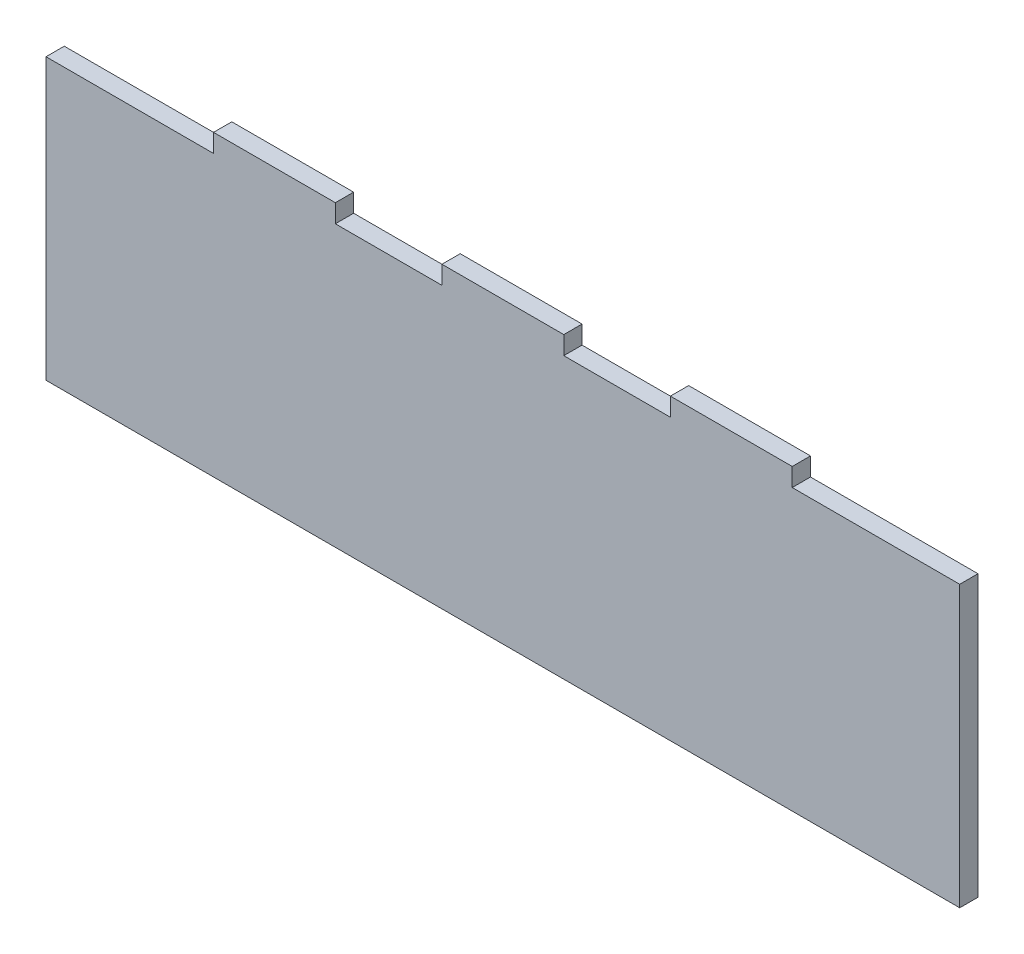
ISO-10303-21;
HEADER;
FILE_DESCRIPTION(('STEP AP214'),'2;1');
FILE_NAME('part.step','',(''),(''),'','','');
FILE_SCHEMA(('AUTOMOTIVE_DESIGN { 1 0 10303 214 1 1 1 1 }'));
ENDSEC;
DATA;
#1=APPLICATION_CONTEXT('core data for automotive mechanical design processes');
#2=APPLICATION_PROTOCOL_DEFINITION('international standard','automotive_design',2000,#1);
#3=PRODUCT_CONTEXT('',#1,'mechanical');
#4=PRODUCT('Part','Part','',(#3));
#5=PRODUCT_RELATED_PRODUCT_CATEGORY('part','',(#4));
#6=PRODUCT_DEFINITION_FORMATION('','',#4);
#7=PRODUCT_DEFINITION_CONTEXT('part definition',#1,'design');
#8=PRODUCT_DEFINITION('design','',#6,#7);
#9=PRODUCT_DEFINITION_SHAPE('','',#8);
#10=(LENGTH_UNIT() NAMED_UNIT(*) SI_UNIT(.MILLI.,.METRE.));
#11=(NAMED_UNIT(*) PLANE_ANGLE_UNIT() SI_UNIT($,.RADIAN.));
#12=(NAMED_UNIT(*) SI_UNIT($,.STERADIAN.) SOLID_ANGLE_UNIT());
#13=UNCERTAINTY_MEASURE_WITH_UNIT(LENGTH_MEASURE(1.E-05),#10,'distance_accuracy_value','');
#14=(GEOMETRIC_REPRESENTATION_CONTEXT(3) GLOBAL_UNCERTAINTY_ASSIGNED_CONTEXT((#13)) GLOBAL_UNIT_ASSIGNED_CONTEXT((#10,
#11,#12)) REPRESENTATION_CONTEXT('',''));
#15=CARTESIAN_POINT('',(0.,0.,0.));
#16=DIRECTION('',(0.,0.,1.));
#17=DIRECTION('',(1.,0.,0.));
#18=AXIS2_PLACEMENT_3D('',#15,#16,#17);
#19=CARTESIAN_POINT('',(27.5,0.,3.));
#20=DIRECTION('',(-1.,0.,0.));
#21=DIRECTION('',(0.,0.,1.));
#22=AXIS2_PLACEMENT_3D('',#19,#20,#21);
#23=PLANE('',#22);
#24=DIRECTION('',(0.,1.,0.));
#25=VECTOR('',#24,1.);
#26=CARTESIAN_POINT('',(27.5,0.,0.));
#27=LINE('',#26,#25);
#28=CARTESIAN_POINT('',(27.5,23.,0.));
#29=VERTEX_POINT('',#28);
#30=CARTESIAN_POINT('',(27.5,26.,0.));
#31=VERTEX_POINT('',#30);
#32=EDGE_CURVE('E179',#29,#31,#27,.T.);
#33=ORIENTED_EDGE('',*,*,#32,.F.);
#34=DIRECTION('',(0.,0.,-1.));
#35=VECTOR('',#34,1.);
#36=CARTESIAN_POINT('',(27.5,23.,3.));
#37=LINE('',#36,#35);
#38=CARTESIAN_POINT('',(27.5,23.,3.));
#39=VERTEX_POINT('',#38);
#40=EDGE_CURVE('E11',#39,#29,#37,.T.);
#41=ORIENTED_EDGE('',*,*,#40,.F.);
#42=DIRECTION('',(0.,1.,0.));
#43=VECTOR('',#42,1.);
#44=CARTESIAN_POINT('',(27.5,0.,3.));
#45=LINE('',#44,#43);
#46=CARTESIAN_POINT('',(27.5,26.,3.));
#47=VERTEX_POINT('',#46);
#48=EDGE_CURVE('E217',#39,#47,#45,.T.);
#49=ORIENTED_EDGE('',*,*,#48,.T.);
#50=DIRECTION('',(0.,0.,-1.));
#51=VECTOR('',#50,1.);
#52=CARTESIAN_POINT('',(27.5,26.,3.));
#53=LINE('',#52,#51);
#54=EDGE_CURVE('E112',#47,#31,#53,.T.);
#55=ORIENTED_EDGE('',*,*,#54,.T.);
#56=EDGE_LOOP('',(#33,#41,#49,#55));
#57=FACE_BOUND('',#56,.T.);
#58=ADVANCED_FACE('F37',(#57),#23,.T.);
#59=CARTESIAN_POINT('',(0.,23.,3.));
#60=DIRECTION('',(0.,-1.,0.));
#61=DIRECTION('',(0.,0.,-1.));
#62=AXIS2_PLACEMENT_3D('',#59,#60,#61);
#63=PLANE('',#62);
#64=DIRECTION('',(-1.,0.,0.));
#65=VECTOR('',#64,1.);
#66=CARTESIAN_POINT('',(0.,23.,0.));
#67=LINE('',#66,#65);
#68=CARTESIAN_POINT('',(10.,23.,0.));
#69=VERTEX_POINT('',#68);
#70=EDGE_CURVE('E182',#29,#69,#67,.T.);
#71=ORIENTED_EDGE('',*,*,#70,.T.);
#72=DIRECTION('',(0.,0.,-1.));
#73=VECTOR('',#72,1.);
#74=CARTESIAN_POINT('',(10.,23.,3.));
#75=LINE('',#74,#73);
#76=CARTESIAN_POINT('',(10.,23.,3.));
#77=VERTEX_POINT('',#76);
#78=EDGE_CURVE('E45',#77,#69,#75,.T.);
#79=ORIENTED_EDGE('',*,*,#78,.F.);
#80=DIRECTION('',(-1.,0.,0.));
#81=VECTOR('',#80,1.);
#82=CARTESIAN_POINT('',(0.,23.,3.));
#83=LINE('',#82,#81);
#84=EDGE_CURVE('E269',#39,#77,#83,.T.);
#85=ORIENTED_EDGE('',*,*,#84,.F.);
#86=ORIENTED_EDGE('',*,*,#40,.T.);
#87=EDGE_LOOP('',(#71,#79,#85,#86));
#88=FACE_BOUND('',#87,.T.);
#89=ADVANCED_FACE('F311',(#88),#63,.F.);
#90=CARTESIAN_POINT('',(9.99999999999998,0.,3.));
#91=DIRECTION('',(-1.,0.,0.));
#92=DIRECTION('',(0.,-1.,0.));
#93=AXIS2_PLACEMENT_3D('',#90,#91,#92);
#94=PLANE('',#93);
#95=DIRECTION('',(0.,1.,0.));
#96=VECTOR('',#95,1.);
#97=CARTESIAN_POINT('',(9.99999999999998,0.,0.));
#98=LINE('',#97,#96);
#99=CARTESIAN_POINT('',(10.,26.,0.));
#100=VERTEX_POINT('',#99);
#101=EDGE_CURVE('E184',#69,#100,#98,.T.);
#102=ORIENTED_EDGE('',*,*,#101,.T.);
#103=DIRECTION('',(0.,0.,-1.));
#104=VECTOR('',#103,1.);
#105=CARTESIAN_POINT('',(10.,26.,3.));
#106=LINE('',#105,#104);
#107=CARTESIAN_POINT('',(10.,26.,3.));
#108=VERTEX_POINT('',#107);
#109=EDGE_CURVE('E241',#108,#100,#106,.T.);
#110=ORIENTED_EDGE('',*,*,#109,.F.);
#111=DIRECTION('',(0.,1.,0.));
#112=VECTOR('',#111,1.);
#113=CARTESIAN_POINT('',(9.99999999999998,0.,3.));
#114=LINE('',#113,#112);
#115=EDGE_CURVE('E250',#77,#108,#114,.T.);
#116=ORIENTED_EDGE('',*,*,#115,.F.);
#117=ORIENTED_EDGE('',*,*,#78,.T.);
#118=EDGE_LOOP('',(#102,#110,#116,#117));
#119=FACE_BOUND('',#118,.T.);
#120=ADVANCED_FACE('F248',(#119),#94,.F.);
#121=CARTESIAN_POINT('',(0.,26.,3.));
#122=DIRECTION('',(0.,-1.,0.));
#123=DIRECTION('',(1.,0.,0.));
#124=AXIS2_PLACEMENT_3D('',#121,#122,#123);
#125=PLANE('',#124);
#126=DIRECTION('',(-1.,0.,0.));
#127=VECTOR('',#126,1.);
#128=CARTESIAN_POINT('',(0.,26.,0.));
#129=LINE('',#128,#127);
#130=CARTESIAN_POINT('',(-10.,26.,0.));
#131=VERTEX_POINT('',#130);
#132=EDGE_CURVE('E186',#100,#131,#129,.T.);
#133=ORIENTED_EDGE('',*,*,#132,.T.);
#134=DIRECTION('',(0.,0.,-1.));
#135=VECTOR('',#134,1.);
#136=CARTESIAN_POINT('',(-10.,26.,3.));
#137=LINE('',#136,#135);
#138=CARTESIAN_POINT('',(-10.,26.,3.));
#139=VERTEX_POINT('',#138);
#140=EDGE_CURVE('E239',#139,#131,#137,.T.);
#141=ORIENTED_EDGE('',*,*,#140,.F.);
#142=DIRECTION('',(-1.,0.,0.));
#143=VECTOR('',#142,1.);
#144=CARTESIAN_POINT('',(0.,26.,3.));
#145=LINE('',#144,#143);
#146=EDGE_CURVE('E263',#108,#139,#145,.T.);
#147=ORIENTED_EDGE('',*,*,#146,.F.);
#148=ORIENTED_EDGE('',*,*,#109,.T.);
#149=EDGE_LOOP('',(#133,#141,#147,#148));
#150=FACE_BOUND('',#149,.T.);
#151=ADVANCED_FACE('F260',(#150),#125,.F.);
#152=CARTESIAN_POINT('',(-10.,0.,3.));
#153=DIRECTION('',(-1.,0.,0.));
#154=DIRECTION('',(0.,-1.,0.));
#155=AXIS2_PLACEMENT_3D('',#152,#153,#154);
#156=PLANE('',#155);
#157=DIRECTION('',(0.,1.,0.));
#158=VECTOR('',#157,1.);
#159=CARTESIAN_POINT('',(-10.,0.,0.));
#160=LINE('',#159,#158);
#161=CARTESIAN_POINT('',(-10.,23.,0.));
#162=VERTEX_POINT('',#161);
#163=EDGE_CURVE('E189',#162,#131,#160,.T.);
#164=ORIENTED_EDGE('',*,*,#163,.F.);
#165=DIRECTION('',(0.,0.,-1.));
#166=VECTOR('',#165,1.);
#167=CARTESIAN_POINT('',(-10.,23.,3.));
#168=LINE('',#167,#166);
#169=CARTESIAN_POINT('',(-10.,23.,3.));
#170=VERTEX_POINT('',#169);
#171=EDGE_CURVE('E237',#170,#162,#168,.T.);
#172=ORIENTED_EDGE('',*,*,#171,.F.);
#173=DIRECTION('',(0.,1.,0.));
#174=VECTOR('',#173,1.);
#175=CARTESIAN_POINT('',(-10.,0.,3.));
#176=LINE('',#175,#174);
#177=EDGE_CURVE('E265',#170,#139,#176,.T.);
#178=ORIENTED_EDGE('',*,*,#177,.T.);
#179=ORIENTED_EDGE('',*,*,#140,.T.);
#180=EDGE_LOOP('',(#164,#172,#178,#179));
#181=FACE_BOUND('',#180,.T.);
#182=ADVANCED_FACE('F421',(#181),#156,.T.);
#183=CARTESIAN_POINT('',(0.,23.,3.));
#184=DIRECTION('',(0.,-1.,0.));
#185=DIRECTION('',(0.,0.,-1.));
#186=AXIS2_PLACEMENT_3D('',#183,#184,#185);
#187=PLANE('',#186);
#188=DIRECTION('',(-1.,0.,0.));
#189=VECTOR('',#188,1.);
#190=CARTESIAN_POINT('',(0.,23.,0.));
#191=LINE('',#190,#189);
#192=CARTESIAN_POINT('',(-27.5,23.,0.));
#193=VERTEX_POINT('',#192);
#194=EDGE_CURVE('E192',#162,#193,#191,.T.);
#195=ORIENTED_EDGE('',*,*,#194,.T.);
#196=DIRECTION('',(0.,0.,-1.));
#197=VECTOR('',#196,1.);
#198=CARTESIAN_POINT('',(-27.5,23.,3.));
#199=LINE('',#198,#197);
#200=CARTESIAN_POINT('',(-27.5,23.,3.));
#201=VERTEX_POINT('',#200);
#202=EDGE_CURVE('E234',#201,#193,#199,.T.);
#203=ORIENTED_EDGE('',*,*,#202,.F.);
#204=DIRECTION('',(-1.,0.,0.));
#205=VECTOR('',#204,1.);
#206=CARTESIAN_POINT('',(0.,23.,3.));
#207=LINE('',#206,#205);
#208=EDGE_CURVE('E267',#170,#201,#207,.T.);
#209=ORIENTED_EDGE('',*,*,#208,.F.);
#210=ORIENTED_EDGE('',*,*,#171,.T.);
#211=EDGE_LOOP('',(#195,#203,#209,#210));
#212=FACE_BOUND('',#211,.T.);
#213=ADVANCED_FACE('F411',(#212),#187,.F.);
#214=CARTESIAN_POINT('',(-27.5,0.,3.));
#215=DIRECTION('',(-1.,0.,0.));
#216=DIRECTION('',(0.,-1.,0.));
#217=AXIS2_PLACEMENT_3D('',#214,#215,#216);
#218=PLANE('',#217);
#219=DIRECTION('',(0.,1.,0.));
#220=VECTOR('',#219,1.);
#221=CARTESIAN_POINT('',(-27.5,0.,0.));
#222=LINE('',#221,#220);
#223=CARTESIAN_POINT('',(-27.5,26.,0.));
#224=VERTEX_POINT('',#223);
#225=EDGE_CURVE('E194',#193,#224,#222,.T.);
#226=ORIENTED_EDGE('',*,*,#225,.T.);
#227=DIRECTION('',(0.,0.,-1.));
#228=VECTOR('',#227,1.);
#229=CARTESIAN_POINT('',(-27.5,26.,3.));
#230=LINE('',#229,#228);
#231=CARTESIAN_POINT('',(-27.5,26.,3.));
#232=VERTEX_POINT('',#231);
#233=EDGE_CURVE('E231',#232,#224,#230,.T.);
#234=ORIENTED_EDGE('',*,*,#233,.F.);
#235=DIRECTION('',(0.,1.,0.));
#236=VECTOR('',#235,1.);
#237=CARTESIAN_POINT('',(-27.5,0.,3.));
#238=LINE('',#237,#236);
#239=EDGE_CURVE('E274',#201,#232,#238,.T.);
#240=ORIENTED_EDGE('',*,*,#239,.F.);
#241=ORIENTED_EDGE('',*,*,#202,.T.);
#242=EDGE_LOOP('',(#226,#234,#240,#241));
#243=FACE_BOUND('',#242,.T.);
#244=ADVANCED_FACE('F401',(#243),#218,.F.);
#245=CARTESIAN_POINT('',(0.,26.,3.));
#246=DIRECTION('',(0.,-1.,0.));
#247=DIRECTION('',(1.,0.,0.));
#248=AXIS2_PLACEMENT_3D('',#245,#246,#247);
#249=PLANE('',#248);
#250=DIRECTION('',(-1.,0.,0.));
#251=VECTOR('',#250,1.);
#252=CARTESIAN_POINT('',(0.,26.,0.));
#253=LINE('',#252,#251);
#254=CARTESIAN_POINT('',(-47.5,26.,0.));
#255=VERTEX_POINT('',#254);
#256=EDGE_CURVE('E196',#224,#255,#253,.T.);
#257=ORIENTED_EDGE('',*,*,#256,.T.);
#258=DIRECTION('',(0.,0.,-1.));
#259=VECTOR('',#258,1.);
#260=CARTESIAN_POINT('',(-47.5,26.,3.));
#261=LINE('',#260,#259);
#262=CARTESIAN_POINT('',(-47.5,26.,3.));
#263=VERTEX_POINT('',#262);
#264=EDGE_CURVE('E229',#263,#255,#261,.T.);
#265=ORIENTED_EDGE('',*,*,#264,.F.);
#266=DIRECTION('',(-1.,0.,0.));
#267=VECTOR('',#266,1.);
#268=CARTESIAN_POINT('',(0.,26.,3.));
#269=LINE('',#268,#267);
#270=EDGE_CURVE('E276',#232,#263,#269,.T.);
#271=ORIENTED_EDGE('',*,*,#270,.F.);
#272=ORIENTED_EDGE('',*,*,#233,.T.);
#273=EDGE_LOOP('',(#257,#265,#271,#272));
#274=FACE_BOUND('',#273,.T.);
#275=ADVANCED_FACE('F391',(#274),#249,.F.);
#276=CARTESIAN_POINT('',(-47.5,0.,3.));
#277=DIRECTION('',(-1.,0.,0.));
#278=DIRECTION('',(0.,0.,1.));
#279=AXIS2_PLACEMENT_3D('',#276,#277,#278);
#280=PLANE('',#279);
#281=DIRECTION('',(0.,1.,0.));
#282=VECTOR('',#281,1.);
#283=CARTESIAN_POINT('',(-47.5,0.,0.));
#284=LINE('',#283,#282);
#285=CARTESIAN_POINT('',(-47.5,23.,0.));
#286=VERTEX_POINT('',#285);
#287=EDGE_CURVE('E199',#286,#255,#284,.T.);
#288=ORIENTED_EDGE('',*,*,#287,.F.);
#289=DIRECTION('',(0.,0.,-1.));
#290=VECTOR('',#289,1.);
#291=CARTESIAN_POINT('',(-47.5,23.,3.));
#292=LINE('',#291,#290);
#293=CARTESIAN_POINT('',(-47.5,23.,3.));
#294=VERTEX_POINT('',#293);
#295=EDGE_CURVE('E227',#294,#286,#292,.T.);
#296=ORIENTED_EDGE('',*,*,#295,.F.);
#297=DIRECTION('',(0.,1.,0.));
#298=VECTOR('',#297,1.);
#299=CARTESIAN_POINT('',(-47.5,0.,3.));
#300=LINE('',#299,#298);
#301=EDGE_CURVE('E278',#294,#263,#300,.T.);
#302=ORIENTED_EDGE('',*,*,#301,.T.);
#303=ORIENTED_EDGE('',*,*,#264,.T.);
#304=EDGE_LOOP('',(#288,#296,#302,#303));
#305=FACE_BOUND('',#304,.T.);
#306=ADVANCED_FACE('F380',(#305),#280,.T.);
#307=CARTESIAN_POINT('',(0.,23.,3.));
#308=DIRECTION('',(0.,-1.,0.));
#309=DIRECTION('',(0.,0.,-1.));
#310=AXIS2_PLACEMENT_3D('',#307,#308,#309);
#311=PLANE('',#310);
#312=DIRECTION('',(-1.,0.,0.));
#313=VECTOR('',#312,1.);
#314=CARTESIAN_POINT('',(0.,23.,0.));
#315=LINE('',#314,#313);
#316=CARTESIAN_POINT('',(-75.,23.,0.));
#317=VERTEX_POINT('',#316);
#318=EDGE_CURVE('E202',#286,#317,#315,.T.);
#319=ORIENTED_EDGE('',*,*,#318,.T.);
#320=DIRECTION('',(0.,0.,-1.));
#321=VECTOR('',#320,1.);
#322=CARTESIAN_POINT('',(-75.,23.,3.));
#323=LINE('',#322,#321);
#324=CARTESIAN_POINT('',(-75.,23.,3.));
#325=VERTEX_POINT('',#324);
#326=EDGE_CURVE('E225',#325,#317,#323,.T.);
#327=ORIENTED_EDGE('',*,*,#326,.F.);
#328=DIRECTION('',(-1.,0.,0.));
#329=VECTOR('',#328,1.);
#330=CARTESIAN_POINT('',(0.,23.,3.));
#331=LINE('',#330,#329);
#332=EDGE_CURVE('E281',#294,#325,#331,.T.);
#333=ORIENTED_EDGE('',*,*,#332,.F.);
#334=ORIENTED_EDGE('',*,*,#295,.T.);
#335=EDGE_LOOP('',(#319,#327,#333,#334));
#336=FACE_BOUND('',#335,.T.);
#337=ADVANCED_FACE('F371',(#336),#311,.F.);
#338=CARTESIAN_POINT('',(-75.,0.,3.));
#339=DIRECTION('',(-1.,0.,0.));
#340=DIRECTION('',(0.,0.,1.));
#341=AXIS2_PLACEMENT_3D('',#338,#339,#340);
#342=PLANE('',#341);
#343=DIRECTION('',(0.,1.,0.));
#344=VECTOR('',#343,1.);
#345=CARTESIAN_POINT('',(-75.,0.,0.));
#346=LINE('',#345,#344);
#347=CARTESIAN_POINT('',(-75.,-23.,0.));
#348=VERTEX_POINT('',#347);
#349=EDGE_CURVE('E205',#348,#317,#346,.T.);
#350=ORIENTED_EDGE('',*,*,#349,.F.);
#351=DIRECTION('',(0.,0.,-1.));
#352=VECTOR('',#351,1.);
#353=CARTESIAN_POINT('',(-75.,-23.,3.));
#354=LINE('',#353,#352);
#355=CARTESIAN_POINT('',(-75.,-23.,3.));
#356=VERTEX_POINT('',#355);
#357=EDGE_CURVE('E223',#356,#348,#354,.T.);
#358=ORIENTED_EDGE('',*,*,#357,.F.);
#359=DIRECTION('',(0.,1.,0.));
#360=VECTOR('',#359,1.);
#361=CARTESIAN_POINT('',(-75.,0.,3.));
#362=LINE('',#361,#360);
#363=EDGE_CURVE('E283',#356,#325,#362,.T.);
#364=ORIENTED_EDGE('',*,*,#363,.T.);
#365=ORIENTED_EDGE('',*,*,#326,.T.);
#366=EDGE_LOOP('',(#350,#358,#364,#365));
#367=FACE_BOUND('',#366,.T.);
#368=ADVANCED_FACE('F297',(#367),#342,.T.);
#369=CARTESIAN_POINT('',(0.,-23.,3.));
#370=DIRECTION('',(0.,-1.,0.));
#371=DIRECTION('',(1.,0.,0.));
#372=AXIS2_PLACEMENT_3D('',#369,#370,#371);
#373=PLANE('',#372);
#374=DIRECTION('',(-1.,0.,0.));
#375=VECTOR('',#374,1.);
#376=CARTESIAN_POINT('',(0.,-23.,0.));
#377=LINE('',#376,#375);
#378=CARTESIAN_POINT('',(75.,-23.,0.));
#379=VERTEX_POINT('',#378);
#380=EDGE_CURVE('E208',#379,#348,#377,.T.);
#381=ORIENTED_EDGE('',*,*,#380,.F.);
#382=DIRECTION('',(0.,0.,-1.));
#383=VECTOR('',#382,1.);
#384=CARTESIAN_POINT('',(75.,-23.,3.));
#385=LINE('',#384,#383);
#386=CARTESIAN_POINT('',(75.,-23.,3.));
#387=VERTEX_POINT('',#386);
#388=EDGE_CURVE('E221',#387,#379,#385,.T.);
#389=ORIENTED_EDGE('',*,*,#388,.F.);
#390=DIRECTION('',(-1.,0.,0.));
#391=VECTOR('',#390,1.);
#392=CARTESIAN_POINT('',(0.,-23.,3.));
#393=LINE('',#392,#391);
#394=EDGE_CURVE('E286',#387,#356,#393,.T.);
#395=ORIENTED_EDGE('',*,*,#394,.T.);
#396=ORIENTED_EDGE('',*,*,#357,.T.);
#397=EDGE_LOOP('',(#381,#389,#395,#396));
#398=FACE_BOUND('',#397,.T.);
#399=ADVANCED_FACE('F290',(#398),#373,.T.);
#400=CARTESIAN_POINT('',(75.,0.,3.));
#401=DIRECTION('',(-1.,0.,0.));
#402=DIRECTION('',(0.,0.,1.));
#403=AXIS2_PLACEMENT_3D('',#400,#401,#402);
#404=PLANE('',#403);
#405=DIRECTION('',(0.,1.,0.));
#406=VECTOR('',#405,1.);
#407=CARTESIAN_POINT('',(75.,0.,0.));
#408=LINE('',#407,#406);
#409=CARTESIAN_POINT('',(75.,23.,0.));
#410=VERTEX_POINT('',#409);
#411=EDGE_CURVE('E211',#379,#410,#408,.T.);
#412=ORIENTED_EDGE('',*,*,#411,.T.);
#413=DIRECTION('',(0.,0.,-1.));
#414=VECTOR('',#413,1.);
#415=CARTESIAN_POINT('',(75.,23.,3.));
#416=LINE('',#415,#414);
#417=CARTESIAN_POINT('',(75.,23.,3.));
#418=VERTEX_POINT('',#417);
#419=EDGE_CURVE('E171',#418,#410,#416,.T.);
#420=ORIENTED_EDGE('',*,*,#419,.F.);
#421=DIRECTION('',(0.,1.,0.));
#422=VECTOR('',#421,1.);
#423=CARTESIAN_POINT('',(75.,0.,3.));
#424=LINE('',#423,#422);
#425=EDGE_CURVE('E162',#387,#418,#424,.T.);
#426=ORIENTED_EDGE('',*,*,#425,.F.);
#427=ORIENTED_EDGE('',*,*,#388,.T.);
#428=EDGE_LOOP('',(#412,#420,#426,#427));
#429=FACE_BOUND('',#428,.T.);
#430=ADVANCED_FACE('F301',(#429),#404,.F.);
#431=CARTESIAN_POINT('',(0.,23.,3.));
#432=DIRECTION('',(0.,-1.,0.));
#433=DIRECTION('',(1.,0.,0.));
#434=AXIS2_PLACEMENT_3D('',#431,#432,#433);
#435=PLANE('',#434);
#436=DIRECTION('',(-1.,0.,0.));
#437=VECTOR('',#436,1.);
#438=CARTESIAN_POINT('',(0.,23.,0.));
#439=LINE('',#438,#437);
#440=CARTESIAN_POINT('',(47.5,23.,0.));
#441=VERTEX_POINT('',#440);
#442=EDGE_CURVE('E170',#410,#441,#439,.T.);
#443=ORIENTED_EDGE('',*,*,#442,.T.);
#444=DIRECTION('',(0.,0.,-1.));
#445=VECTOR('',#444,1.);
#446=CARTESIAN_POINT('',(47.5,23.,3.));
#447=LINE('',#446,#445);
#448=CARTESIAN_POINT('',(47.5,23.,3.));
#449=VERTEX_POINT('',#448);
#450=EDGE_CURVE('E167',#449,#441,#447,.T.);
#451=ORIENTED_EDGE('',*,*,#450,.F.);
#452=DIRECTION('',(-1.,0.,0.));
#453=VECTOR('',#452,1.);
#454=CARTESIAN_POINT('',(0.,23.,3.));
#455=LINE('',#454,#453);
#456=EDGE_CURVE('E155',#418,#449,#455,.T.);
#457=ORIENTED_EDGE('',*,*,#456,.F.);
#458=ORIENTED_EDGE('',*,*,#419,.T.);
#459=EDGE_LOOP('',(#443,#451,#457,#458));
#460=FACE_BOUND('',#459,.T.);
#461=ADVANCED_FACE('F168',(#460),#435,.F.);
#462=CARTESIAN_POINT('',(47.5,0.,3.));
#463=DIRECTION('',(-1.,0.,0.));
#464=DIRECTION('',(0.,0.,1.));
#465=AXIS2_PLACEMENT_3D('',#462,#463,#464);
#466=PLANE('',#465);
#467=DIRECTION('',(0.,1.,0.));
#468=VECTOR('',#467,1.);
#469=CARTESIAN_POINT('',(47.5,0.,0.));
#470=LINE('',#469,#468);
#471=CARTESIAN_POINT('',(47.5,26.,0.));
#472=VERTEX_POINT('',#471);
#473=EDGE_CURVE('E105',#441,#472,#470,.T.);
#474=ORIENTED_EDGE('',*,*,#473,.T.);
#475=DIRECTION('',(0.,0.,-1.));
#476=VECTOR('',#475,1.);
#477=CARTESIAN_POINT('',(47.5,26.,3.));
#478=LINE('',#477,#476);
#479=CARTESIAN_POINT('',(47.5,26.,3.));
#480=VERTEX_POINT('',#479);
#481=EDGE_CURVE('E172',#480,#472,#478,.T.);
#482=ORIENTED_EDGE('',*,*,#481,.F.);
#483=DIRECTION('',(0.,1.,0.));
#484=VECTOR('',#483,1.);
#485=CARTESIAN_POINT('',(47.5,0.,3.));
#486=LINE('',#485,#484);
#487=EDGE_CURVE('E159',#449,#480,#486,.T.);
#488=ORIENTED_EDGE('',*,*,#487,.F.);
#489=ORIENTED_EDGE('',*,*,#450,.T.);
#490=EDGE_LOOP('',(#474,#482,#488,#489));
#491=FACE_BOUND('',#490,.T.);
#492=ADVANCED_FACE('F174',(#491),#466,.F.);
#493=CARTESIAN_POINT('',(0.,26.,3.));
#494=DIRECTION('',(0.,-1.,0.));
#495=DIRECTION('',(0.,0.,-1.));
#496=AXIS2_PLACEMENT_3D('',#493,#494,#495);
#497=PLANE('',#496);
#498=DIRECTION('',(-1.,0.,0.));
#499=VECTOR('',#498,1.);
#500=CARTESIAN_POINT('',(0.,26.,0.));
#501=LINE('',#500,#499);
#502=EDGE_CURVE('E215',#472,#31,#501,.T.);
#503=ORIENTED_EDGE('',*,*,#502,.T.);
#504=ORIENTED_EDGE('',*,*,#54,.F.);
#505=DIRECTION('',(-1.,0.,0.));
#506=VECTOR('',#505,1.);
#507=CARTESIAN_POINT('',(0.,26.,3.));
#508=LINE('',#507,#506);
#509=EDGE_CURVE('E53',#480,#47,#508,.T.);
#510=ORIENTED_EDGE('',*,*,#509,.F.);
#511=ORIENTED_EDGE('',*,*,#481,.T.);
#512=EDGE_LOOP('',(#503,#504,#510,#511));
#513=FACE_BOUND('',#512,.T.);
#514=ADVANCED_FACE('F317',(#513),#497,.F.);
#515=CARTESIAN_POINT('',(0.,0.,3.));
#516=DIRECTION('',(0.,0.,1.));
#517=DIRECTION('',(1.,0.,0.));
#518=AXIS2_PLACEMENT_3D('',#515,#516,#517);
#519=PLANE('',#518);
#520=ORIENTED_EDGE('',*,*,#48,.F.);
#521=ORIENTED_EDGE('',*,*,#84,.T.);
#522=ORIENTED_EDGE('',*,*,#115,.T.);
#523=ORIENTED_EDGE('',*,*,#146,.T.);
#524=ORIENTED_EDGE('',*,*,#177,.F.);
#525=ORIENTED_EDGE('',*,*,#208,.T.);
#526=ORIENTED_EDGE('',*,*,#239,.T.);
#527=ORIENTED_EDGE('',*,*,#270,.T.);
#528=ORIENTED_EDGE('',*,*,#301,.F.);
#529=ORIENTED_EDGE('',*,*,#332,.T.);
#530=ORIENTED_EDGE('',*,*,#363,.F.);
#531=ORIENTED_EDGE('',*,*,#394,.F.);
#532=ORIENTED_EDGE('',*,*,#425,.T.);
#533=ORIENTED_EDGE('',*,*,#456,.T.);
#534=ORIENTED_EDGE('',*,*,#487,.T.);
#535=ORIENTED_EDGE('',*,*,#509,.T.);
#536=EDGE_LOOP('',(#520,#521,#522,#523,#524,#525,#526,#527,#528,#529,#530,#531,#532,#533,#534,#535));
#537=FACE_BOUND('',#536,.T.);
#538=ADVANCED_FACE('F157',(#537),#519,.T.);
#539=CARTESIAN_POINT('',(0.,0.,0.));
#540=DIRECTION('',(0.,0.,1.));
#541=DIRECTION('',(1.,0.,0.));
#542=AXIS2_PLACEMENT_3D('',#539,#540,#541);
#543=PLANE('',#542);
#544=ORIENTED_EDGE('',*,*,#32,.T.);
#545=ORIENTED_EDGE('',*,*,#502,.F.);
#546=ORIENTED_EDGE('',*,*,#473,.F.);
#547=ORIENTED_EDGE('',*,*,#442,.F.);
#548=ORIENTED_EDGE('',*,*,#411,.F.);
#549=ORIENTED_EDGE('',*,*,#380,.T.);
#550=ORIENTED_EDGE('',*,*,#349,.T.);
#551=ORIENTED_EDGE('',*,*,#318,.F.);
#552=ORIENTED_EDGE('',*,*,#287,.T.);
#553=ORIENTED_EDGE('',*,*,#256,.F.);
#554=ORIENTED_EDGE('',*,*,#225,.F.);
#555=ORIENTED_EDGE('',*,*,#194,.F.);
#556=ORIENTED_EDGE('',*,*,#163,.T.);
#557=ORIENTED_EDGE('',*,*,#132,.F.);
#558=ORIENTED_EDGE('',*,*,#101,.F.);
#559=ORIENTED_EDGE('',*,*,#70,.F.);
#560=EDGE_LOOP('',(#544,#545,#546,#547,#548,#549,#550,#551,#552,#553,#554,#555,#556,#557,#558,#559));
#561=FACE_BOUND('',#560,.T.);
#562=ADVANCED_FACE('F255',(#561),#543,.F.);
#563=CLOSED_SHELL('',(#58,#89,#120,#151,#182,#213,#244,#275,#306,#337,#368,#399,#430,#461,#492,
#514,#538,#562));
#564=MANIFOLD_SOLID_BREP('B2',#563);
#565=ADVANCED_BREP_SHAPE_REPRESENTATION('',(#18,#564),#14);
#566=SHAPE_DEFINITION_REPRESENTATION(#9,#565);
ENDSEC;
END-ISO-10303-21;
